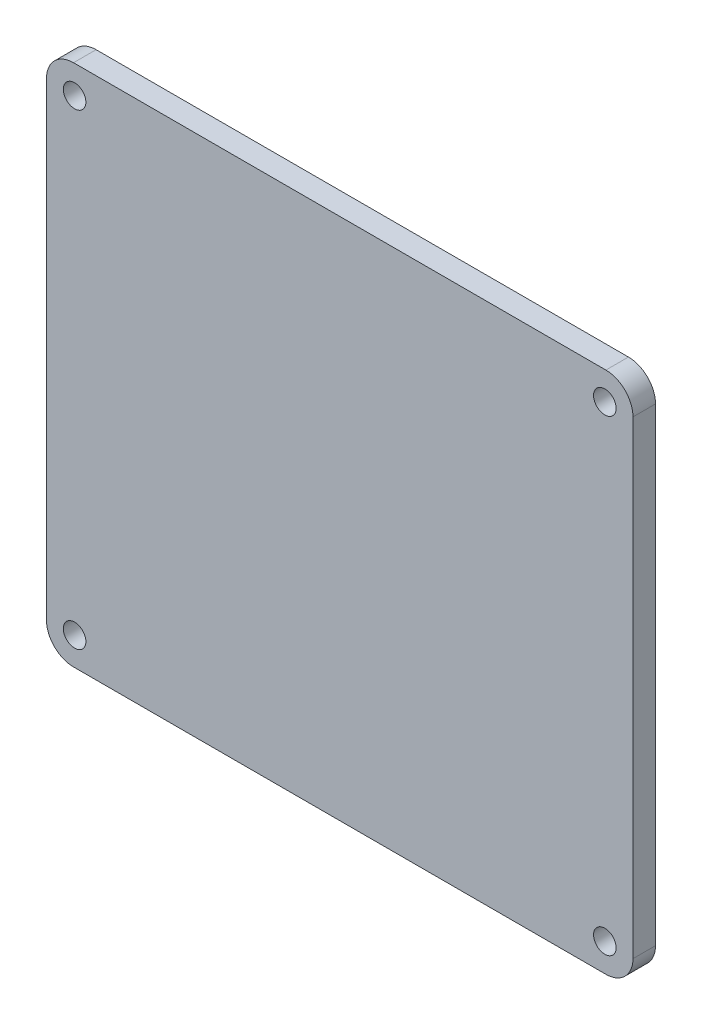
ISO-10303-21;
HEADER;
FILE_DESCRIPTION(('STEP AP214'),'2;1');
FILE_NAME('part.step','',(''),(''),'','','');
FILE_SCHEMA(('AUTOMOTIVE_DESIGN { 1 0 10303 214 1 1 1 1 }'));
ENDSEC;
DATA;
#1=APPLICATION_CONTEXT('core data for automotive mechanical design processes');
#2=APPLICATION_PROTOCOL_DEFINITION('international standard','automotive_design',2000,#1);
#3=PRODUCT_CONTEXT('',#1,'mechanical');
#4=PRODUCT('Part','Part','',(#3));
#5=PRODUCT_RELATED_PRODUCT_CATEGORY('part','',(#4));
#6=PRODUCT_DEFINITION_FORMATION('','',#4);
#7=PRODUCT_DEFINITION_CONTEXT('part definition',#1,'design');
#8=PRODUCT_DEFINITION('design','',#6,#7);
#9=PRODUCT_DEFINITION_SHAPE('','',#8);
#10=(LENGTH_UNIT() NAMED_UNIT(*) SI_UNIT(.MILLI.,.METRE.));
#11=(NAMED_UNIT(*) PLANE_ANGLE_UNIT() SI_UNIT($,.RADIAN.));
#12=(NAMED_UNIT(*) SI_UNIT($,.STERADIAN.) SOLID_ANGLE_UNIT());
#13=UNCERTAINTY_MEASURE_WITH_UNIT(LENGTH_MEASURE(1.E-05),#10,'distance_accuracy_value','');
#14=(GEOMETRIC_REPRESENTATION_CONTEXT(3) GLOBAL_UNCERTAINTY_ASSIGNED_CONTEXT((#13)) GLOBAL_UNIT_ASSIGNED_CONTEXT((#10,
#11,#12)) REPRESENTATION_CONTEXT('',''));
#15=CARTESIAN_POINT('',(0.,0.,0.));
#16=DIRECTION('',(0.,0.,1.));
#17=DIRECTION('',(1.,0.,0.));
#18=AXIS2_PLACEMENT_3D('',#15,#16,#17);
#19=CARTESIAN_POINT('',(0.,0.,2.5));
#20=DIRECTION('',(0.,1.,0.));
#21=DIRECTION('',(-1.,0.,0.));
#22=AXIS2_PLACEMENT_3D('',#19,#20,#21);
#23=PLANE('',#22);
#24=DIRECTION('',(1.,0.,0.));
#25=VECTOR('',#24,1.);
#26=CARTESIAN_POINT('',(0.,0.,0.));
#27=LINE('',#26,#25);
#28=CARTESIAN_POINT('',(3.,0.,0.));
#29=VERTEX_POINT('',#28);
#30=CARTESIAN_POINT('',(62.,0.,0.));
#31=VERTEX_POINT('',#30);
#32=EDGE_CURVE('E158',#29,#31,#27,.T.);
#33=ORIENTED_EDGE('',*,*,#32,.T.);
#34=DIRECTION('',(0.,0.,-1.));
#35=VECTOR('',#34,1.);
#36=CARTESIAN_POINT('',(62.,0.,2.5));
#37=LINE('',#36,#35);
#38=CARTESIAN_POINT('',(62.,0.,2.5));
#39=VERTEX_POINT('',#38);
#40=EDGE_CURVE('E145',#31,#39,#37,.F.);
#41=ORIENTED_EDGE('',*,*,#40,.T.);
#42=DIRECTION('',(1.,0.,0.));
#43=VECTOR('',#42,1.);
#44=CARTESIAN_POINT('',(0.,0.,2.5));
#45=LINE('',#44,#43);
#46=CARTESIAN_POINT('',(3.,0.,2.5));
#47=VERTEX_POINT('',#46);
#48=EDGE_CURVE('E160',#47,#39,#45,.T.);
#49=ORIENTED_EDGE('',*,*,#48,.F.);
#50=DIRECTION('',(0.,0.,-1.));
#51=VECTOR('',#50,1.);
#52=CARTESIAN_POINT('',(3.,0.,0.));
#53=LINE('',#52,#51);
#54=EDGE_CURVE('E142',#47,#29,#53,.T.);
#55=ORIENTED_EDGE('',*,*,#54,.T.);
#56=EDGE_LOOP('',(#33,#41,#49,#55));
#57=FACE_BOUND('',#56,.T.);
#58=ADVANCED_FACE('F33',(#57),#23,.F.);
#59=CARTESIAN_POINT('',(65.,0.,2.5));
#60=DIRECTION('',(-1.,0.,0.));
#61=DIRECTION('',(0.,0.,1.));
#62=AXIS2_PLACEMENT_3D('',#59,#60,#61);
#63=PLANE('',#62);
#64=DIRECTION('',(0.,1.,0.));
#65=VECTOR('',#64,1.);
#66=CARTESIAN_POINT('',(65.,0.,0.));
#67=LINE('',#66,#65);
#68=CARTESIAN_POINT('',(65.,3.,0.));
#69=VERTEX_POINT('',#68);
#70=CARTESIAN_POINT('',(65.,55.,0.));
#71=VERTEX_POINT('',#70);
#72=EDGE_CURVE('E116',#69,#71,#67,.T.);
#73=ORIENTED_EDGE('',*,*,#72,.T.);
#74=DIRECTION('',(0.,0.,-1.));
#75=VECTOR('',#74,1.);
#76=CARTESIAN_POINT('',(65.,55.,2.5));
#77=LINE('',#76,#75);
#78=CARTESIAN_POINT('',(65.,55.,2.5));
#79=VERTEX_POINT('',#78);
#80=EDGE_CURVE('E133',#71,#79,#77,.F.);
#81=ORIENTED_EDGE('',*,*,#80,.T.);
#82=DIRECTION('',(0.,1.,0.));
#83=VECTOR('',#82,1.);
#84=CARTESIAN_POINT('',(65.,0.,2.5));
#85=LINE('',#84,#83);
#86=CARTESIAN_POINT('',(65.,3.,2.5));
#87=VERTEX_POINT('',#86);
#88=EDGE_CURVE('E171',#87,#79,#85,.T.);
#89=ORIENTED_EDGE('',*,*,#88,.F.);
#90=DIRECTION('',(0.,0.,-1.));
#91=VECTOR('',#90,1.);
#92=CARTESIAN_POINT('',(65.,3.,2.5));
#93=LINE('',#92,#91);
#94=EDGE_CURVE('E130',#87,#69,#93,.T.);
#95=ORIENTED_EDGE('',*,*,#94,.T.);
#96=EDGE_LOOP('',(#73,#81,#89,#95));
#97=FACE_BOUND('',#96,.T.);
#98=ADVANCED_FACE('F218',(#97),#63,.F.);
#99=CARTESIAN_POINT('',(0.,58.,2.5));
#100=DIRECTION('',(0.,1.,0.));
#101=DIRECTION('',(-1.,0.,0.));
#102=AXIS2_PLACEMENT_3D('',#99,#100,#101);
#103=PLANE('',#102);
#104=DIRECTION('',(1.,0.,0.));
#105=VECTOR('',#104,1.);
#106=CARTESIAN_POINT('',(0.,58.,2.5));
#107=LINE('',#106,#105);
#108=CARTESIAN_POINT('',(3.,58.,2.5));
#109=VERTEX_POINT('',#108);
#110=CARTESIAN_POINT('',(62.,58.,2.5));
#111=VERTEX_POINT('',#110);
#112=EDGE_CURVE('E121',#109,#111,#107,.T.);
#113=ORIENTED_EDGE('',*,*,#112,.T.);
#114=DIRECTION('',(0.,0.,-1.));
#115=VECTOR('',#114,1.);
#116=CARTESIAN_POINT('',(62.,58.,0.));
#117=LINE('',#116,#115);
#118=CARTESIAN_POINT('',(62.,58.,0.));
#119=VERTEX_POINT('',#118);
#120=EDGE_CURVE('E108',#111,#119,#117,.T.);
#121=ORIENTED_EDGE('',*,*,#120,.T.);
#122=DIRECTION('',(1.,0.,0.));
#123=VECTOR('',#122,1.);
#124=CARTESIAN_POINT('',(0.,58.,0.));
#125=LINE('',#124,#123);
#126=CARTESIAN_POINT('',(3.,58.,0.));
#127=VERTEX_POINT('',#126);
#128=EDGE_CURVE('E101',#127,#119,#125,.T.);
#129=ORIENTED_EDGE('',*,*,#128,.F.);
#130=DIRECTION('',(0.,0.,-1.));
#131=VECTOR('',#130,1.);
#132=CARTESIAN_POINT('',(3.,58.,2.5));
#133=LINE('',#132,#131);
#134=EDGE_CURVE('E114',#127,#109,#133,.F.);
#135=ORIENTED_EDGE('',*,*,#134,.T.);
#136=EDGE_LOOP('',(#113,#121,#129,#135));
#137=FACE_BOUND('',#136,.T.);
#138=ADVANCED_FACE('F113',(#137),#103,.T.);
#139=CARTESIAN_POINT('',(0.,0.,2.5));
#140=DIRECTION('',(-1.,0.,0.));
#141=DIRECTION('',(0.,-1.,0.));
#142=AXIS2_PLACEMENT_3D('',#139,#140,#141);
#143=PLANE('',#142);
#144=DIRECTION('',(0.,1.,0.));
#145=VECTOR('',#144,1.);
#146=CARTESIAN_POINT('',(0.,0.,0.));
#147=LINE('',#146,#145);
#148=CARTESIAN_POINT('',(0.,3.,0.));
#149=VERTEX_POINT('',#148);
#150=CARTESIAN_POINT('',(0.,55.,0.));
#151=VERTEX_POINT('',#150);
#152=EDGE_CURVE('E102',#149,#151,#147,.T.);
#153=ORIENTED_EDGE('',*,*,#152,.F.);
#154=DIRECTION('',(0.,0.,-1.));
#155=VECTOR('',#154,1.);
#156=CARTESIAN_POINT('',(0.,3.,2.5));
#157=LINE('',#156,#155);
#158=CARTESIAN_POINT('',(0.,3.,2.5));
#159=VERTEX_POINT('',#158);
#160=EDGE_CURVE('E11',#149,#159,#157,.F.);
#161=ORIENTED_EDGE('',*,*,#160,.T.);
#162=DIRECTION('',(0.,1.,0.));
#163=VECTOR('',#162,1.);
#164=CARTESIAN_POINT('',(0.,0.,2.5));
#165=LINE('',#164,#163);
#166=CARTESIAN_POINT('',(0.,55.,2.5));
#167=VERTEX_POINT('',#166);
#168=EDGE_CURVE('E118',#159,#167,#165,.T.);
#169=ORIENTED_EDGE('',*,*,#168,.T.);
#170=DIRECTION('',(0.,0.,-1.));
#171=VECTOR('',#170,1.);
#172=CARTESIAN_POINT('',(0.,55.,2.5));
#173=LINE('',#172,#171);
#174=EDGE_CURVE('E41',#167,#151,#173,.T.);
#175=ORIENTED_EDGE('',*,*,#174,.T.);
#176=EDGE_LOOP('',(#153,#161,#169,#175));
#177=FACE_BOUND('',#176,.T.);
#178=ADVANCED_FACE('F146',(#177),#143,.T.);
#179=CARTESIAN_POINT('',(0.,0.,2.5));
#180=DIRECTION('',(0.,0.,1.));
#181=DIRECTION('',(1.,0.,0.));
#182=AXIS2_PLACEMENT_3D('',#179,#180,#181);
#183=PLANE('',#182);
#184=CARTESIAN_POINT('',(3.1155036511468,3.1155036511468,2.5));
#185=DIRECTION('',(0.,0.,1.));
#186=DIRECTION('',(1.,0.,0.));
#187=AXIS2_PLACEMENT_3D('',#184,#185,#186);
#188=CIRCLE('',#187,1.25);
#189=CARTESIAN_POINT('',(4.3655036511468,3.1155036511468,2.5));
#190=VERTEX_POINT('',#189);
#191=EDGE_CURVE('E180',#190,#190,#188,.T.);
#192=ORIENTED_EDGE('',*,*,#191,.F.);
#193=EDGE_LOOP('',(#192));
#194=FACE_BOUND('',#193,.T.);
#195=CARTESIAN_POINT('',(61.8844963488532,3.11550365114681,2.5));
#196=DIRECTION('',(0.,0.,1.));
#197=DIRECTION('',(1.,0.,0.));
#198=AXIS2_PLACEMENT_3D('',#195,#196,#197);
#199=CIRCLE('',#198,1.25);
#200=CARTESIAN_POINT('',(63.1344963488532,3.11550365114681,2.5));
#201=VERTEX_POINT('',#200);
#202=EDGE_CURVE('E186',#201,#201,#199,.T.);
#203=ORIENTED_EDGE('',*,*,#202,.F.);
#204=EDGE_LOOP('',(#203));
#205=FACE_BOUND('',#204,.T.);
#206=CARTESIAN_POINT('',(61.8844963488532,54.8844963488532,2.5));
#207=DIRECTION('',(0.,0.,1.));
#208=DIRECTION('',(1.,0.,0.));
#209=AXIS2_PLACEMENT_3D('',#206,#207,#208);
#210=CIRCLE('',#209,1.24999999999997);
#211=CARTESIAN_POINT('',(63.1344963488532,54.8844963488532,2.5));
#212=VERTEX_POINT('',#211);
#213=EDGE_CURVE('E175',#212,#212,#210,.T.);
#214=ORIENTED_EDGE('',*,*,#213,.F.);
#215=EDGE_LOOP('',(#214));
#216=FACE_BOUND('',#215,.T.);
#217=CARTESIAN_POINT('',(3.1155036511468,54.8844963488532,2.5));
#218=DIRECTION('',(0.,0.,1.));
#219=DIRECTION('',(1.,0.,0.));
#220=AXIS2_PLACEMENT_3D('',#217,#218,#219);
#221=CIRCLE('',#220,1.25);
#222=CARTESIAN_POINT('',(4.3655036511468,54.8844963488532,2.5));
#223=VERTEX_POINT('',#222);
#224=EDGE_CURVE('E162',#223,#223,#221,.T.);
#225=ORIENTED_EDGE('',*,*,#224,.F.);
#226=EDGE_LOOP('',(#225));
#227=FACE_BOUND('',#226,.T.);
#228=ORIENTED_EDGE('',*,*,#88,.T.);
#229=CARTESIAN_POINT('',(62.,55.,2.5));
#230=DIRECTION('',(0.,0.,1.));
#231=DIRECTION('',(1.,0.,0.));
#232=AXIS2_PLACEMENT_3D('',#229,#230,#231);
#233=CIRCLE('',#232,3.);
#234=EDGE_CURVE('E140',#79,#111,#233,.T.);
#235=ORIENTED_EDGE('',*,*,#234,.T.);
#236=ORIENTED_EDGE('',*,*,#112,.F.);
#237=CARTESIAN_POINT('',(3.,55.,2.5));
#238=DIRECTION('',(0.,0.,1.));
#239=DIRECTION('',(1.,0.,0.));
#240=AXIS2_PLACEMENT_3D('',#237,#238,#239);
#241=CIRCLE('',#240,3.);
#242=EDGE_CURVE('E48',#109,#167,#241,.T.);
#243=ORIENTED_EDGE('',*,*,#242,.T.);
#244=ORIENTED_EDGE('',*,*,#168,.F.);
#245=CARTESIAN_POINT('',(3.,3.,2.5));
#246=DIRECTION('',(0.,0.,1.));
#247=DIRECTION('',(1.,0.,0.));
#248=AXIS2_PLACEMENT_3D('',#245,#246,#247);
#249=CIRCLE('',#248,3.);
#250=EDGE_CURVE('E136',#159,#47,#249,.T.);
#251=ORIENTED_EDGE('',*,*,#250,.T.);
#252=ORIENTED_EDGE('',*,*,#48,.T.);
#253=CARTESIAN_POINT('',(62.,3.,2.5));
#254=DIRECTION('',(0.,0.,1.));
#255=DIRECTION('',(1.,0.,0.));
#256=AXIS2_PLACEMENT_3D('',#253,#254,#255);
#257=CIRCLE('',#256,3.);
#258=EDGE_CURVE('E138',#39,#87,#257,.T.);
#259=ORIENTED_EDGE('',*,*,#258,.T.);
#260=EDGE_LOOP('',(#228,#235,#236,#243,#244,#251,#252,#259));
#261=FACE_BOUND('',#260,.T.);
#262=ADVANCED_FACE('F149',(#194,#205,#216,#227,#261),#183,.T.);
#263=CARTESIAN_POINT('',(0.,0.,0.));
#264=DIRECTION('',(0.,0.,1.));
#265=DIRECTION('',(1.,0.,0.));
#266=AXIS2_PLACEMENT_3D('',#263,#264,#265);
#267=PLANE('',#266);
#268=CARTESIAN_POINT('',(3.1155036511468,3.1155036511468,0.));
#269=DIRECTION('',(0.,0.,1.));
#270=DIRECTION('',(1.,0.,0.));
#271=AXIS2_PLACEMENT_3D('',#268,#269,#270);
#272=CIRCLE('',#271,1.25);
#273=CARTESIAN_POINT('',(4.3655036511468,3.1155036511468,0.));
#274=VERTEX_POINT('',#273);
#275=EDGE_CURVE('E177',#274,#274,#272,.T.);
#276=ORIENTED_EDGE('',*,*,#275,.T.);
#277=EDGE_LOOP('',(#276));
#278=FACE_BOUND('',#277,.T.);
#279=CARTESIAN_POINT('',(61.8844963488532,3.11550365114681,0.));
#280=DIRECTION('',(0.,0.,1.));
#281=DIRECTION('',(1.,0.,0.));
#282=AXIS2_PLACEMENT_3D('',#279,#280,#281);
#283=CIRCLE('',#282,1.25);
#284=CARTESIAN_POINT('',(63.1344963488532,3.11550365114681,0.));
#285=VERTEX_POINT('',#284);
#286=EDGE_CURVE('E183',#285,#285,#283,.T.);
#287=ORIENTED_EDGE('',*,*,#286,.T.);
#288=EDGE_LOOP('',(#287));
#289=FACE_BOUND('',#288,.T.);
#290=CARTESIAN_POINT('',(61.8844963488532,54.8844963488532,0.));
#291=DIRECTION('',(0.,0.,1.));
#292=DIRECTION('',(1.,0.,0.));
#293=AXIS2_PLACEMENT_3D('',#290,#291,#292);
#294=CIRCLE('',#293,1.24999999999997);
#295=CARTESIAN_POINT('',(63.1344963488532,54.8844963488532,0.));
#296=VERTEX_POINT('',#295);
#297=EDGE_CURVE('E189',#296,#296,#294,.T.);
#298=ORIENTED_EDGE('',*,*,#297,.T.);
#299=EDGE_LOOP('',(#298));
#300=FACE_BOUND('',#299,.T.);
#301=CARTESIAN_POINT('',(3.1155036511468,54.8844963488532,0.));
#302=DIRECTION('',(0.,0.,1.));
#303=DIRECTION('',(1.,0.,0.));
#304=AXIS2_PLACEMENT_3D('',#301,#302,#303);
#305=CIRCLE('',#304,1.25);
#306=CARTESIAN_POINT('',(4.3655036511468,54.8844963488532,0.));
#307=VERTEX_POINT('',#306);
#308=EDGE_CURVE('E167',#307,#307,#305,.T.);
#309=ORIENTED_EDGE('',*,*,#308,.T.);
#310=EDGE_LOOP('',(#309));
#311=FACE_BOUND('',#310,.T.);
#312=ORIENTED_EDGE('',*,*,#128,.T.);
#313=CARTESIAN_POINT('',(62.,55.,0.));
#314=DIRECTION('',(0.,0.,1.));
#315=DIRECTION('',(1.,0.,0.));
#316=AXIS2_PLACEMENT_3D('',#313,#314,#315);
#317=CIRCLE('',#316,3.);
#318=EDGE_CURVE('E128',#119,#71,#317,.F.);
#319=ORIENTED_EDGE('',*,*,#318,.T.);
#320=ORIENTED_EDGE('',*,*,#72,.F.);
#321=CARTESIAN_POINT('',(62.,3.,0.));
#322=DIRECTION('',(0.,0.,1.));
#323=DIRECTION('',(1.,0.,0.));
#324=AXIS2_PLACEMENT_3D('',#321,#322,#323);
#325=CIRCLE('',#324,3.);
#326=EDGE_CURVE('E126',#69,#31,#325,.F.);
#327=ORIENTED_EDGE('',*,*,#326,.T.);
#328=ORIENTED_EDGE('',*,*,#32,.F.);
#329=CARTESIAN_POINT('',(3.,3.,0.));
#330=DIRECTION('',(0.,0.,1.));
#331=DIRECTION('',(1.,0.,0.));
#332=AXIS2_PLACEMENT_3D('',#329,#330,#331);
#333=CIRCLE('',#332,3.);
#334=EDGE_CURVE('E107',#29,#149,#333,.F.);
#335=ORIENTED_EDGE('',*,*,#334,.T.);
#336=ORIENTED_EDGE('',*,*,#152,.T.);
#337=CARTESIAN_POINT('',(3.,55.,0.));
#338=DIRECTION('',(0.,0.,1.));
#339=DIRECTION('',(1.,0.,0.));
#340=AXIS2_PLACEMENT_3D('',#337,#338,#339);
#341=CIRCLE('',#340,3.);
#342=EDGE_CURVE('E98',#151,#127,#341,.F.);
#343=ORIENTED_EDGE('',*,*,#342,.T.);
#344=EDGE_LOOP('',(#312,#319,#320,#327,#328,#335,#336,#343));
#345=FACE_BOUND('',#344,.T.);
#346=ADVANCED_FACE('F100',(#278,#289,#300,#311,#345),#267,.F.);
#347=CARTESIAN_POINT('',(3.1155036511468,54.8844963488532,2.5));
#348=DIRECTION('',(0.,0.,-1.));
#349=DIRECTION('',(-1.,0.,0.));
#350=AXIS2_PLACEMENT_3D('',#347,#348,#349);
#351=CYLINDRICAL_SURFACE('',#350,1.25);
#352=ORIENTED_EDGE('',*,*,#224,.T.);
#353=EDGE_LOOP('',(#352));
#354=FACE_BOUND('',#353,.T.);
#355=ORIENTED_EDGE('',*,*,#308,.F.);
#356=EDGE_LOOP('',(#355));
#357=FACE_BOUND('',#356,.T.);
#358=ADVANCED_FACE('F204',(#354,#357),#351,.F.);
#359=CARTESIAN_POINT('',(61.8844963488532,54.8844963488532,2.5));
#360=DIRECTION('',(0.,0.,-1.));
#361=DIRECTION('',(-1.,0.,0.));
#362=AXIS2_PLACEMENT_3D('',#359,#360,#361);
#363=CYLINDRICAL_SURFACE('',#362,1.24999999999997);
#364=ORIENTED_EDGE('',*,*,#213,.T.);
#365=EDGE_LOOP('',(#364));
#366=FACE_BOUND('',#365,.T.);
#367=ORIENTED_EDGE('',*,*,#297,.F.);
#368=EDGE_LOOP('',(#367));
#369=FACE_BOUND('',#368,.T.);
#370=ADVANCED_FACE('F195',(#366,#369),#363,.F.);
#371=CARTESIAN_POINT('',(61.8844963488532,3.11550365114681,2.5));
#372=DIRECTION('',(0.,0.,-1.));
#373=DIRECTION('',(-1.,0.,0.));
#374=AXIS2_PLACEMENT_3D('',#371,#372,#373);
#375=CYLINDRICAL_SURFACE('',#374,1.25);
#376=ORIENTED_EDGE('',*,*,#202,.T.);
#377=EDGE_LOOP('',(#376));
#378=FACE_BOUND('',#377,.T.);
#379=ORIENTED_EDGE('',*,*,#286,.F.);
#380=EDGE_LOOP('',(#379));
#381=FACE_BOUND('',#380,.T.);
#382=ADVANCED_FACE('F301',(#378,#381),#375,.F.);
#383=CARTESIAN_POINT('',(3.1155036511468,3.1155036511468,2.5));
#384=DIRECTION('',(0.,0.,-1.));
#385=DIRECTION('',(-1.,0.,0.));
#386=AXIS2_PLACEMENT_3D('',#383,#384,#385);
#387=CYLINDRICAL_SURFACE('',#386,1.25);
#388=ORIENTED_EDGE('',*,*,#191,.T.);
#389=EDGE_LOOP('',(#388));
#390=FACE_BOUND('',#389,.T.);
#391=ORIENTED_EDGE('',*,*,#275,.F.);
#392=EDGE_LOOP('',(#391));
#393=FACE_BOUND('',#392,.T.);
#394=ADVANCED_FACE('F231',(#390,#393),#387,.F.);
#395=CARTESIAN_POINT('',(62.,55.,2.5));
#396=DIRECTION('',(0.,0.,1.));
#397=DIRECTION('',(1.,0.,0.));
#398=AXIS2_PLACEMENT_3D('',#395,#396,#397);
#399=CYLINDRICAL_SURFACE('',#398,3.);
#400=ORIENTED_EDGE('',*,*,#234,.F.);
#401=ORIENTED_EDGE('',*,*,#80,.F.);
#402=ORIENTED_EDGE('',*,*,#318,.F.);
#403=ORIENTED_EDGE('',*,*,#120,.F.);
#404=EDGE_LOOP('',(#400,#401,#402,#403));
#405=FACE_BOUND('',#404,.T.);
#406=ADVANCED_FACE('F227',(#405),#399,.T.);
#407=CARTESIAN_POINT('',(62.,3.,2.5));
#408=DIRECTION('',(0.,0.,-1.));
#409=DIRECTION('',(-1.,0.,0.));
#410=AXIS2_PLACEMENT_3D('',#407,#408,#409);
#411=CYLINDRICAL_SURFACE('',#410,3.);
#412=ORIENTED_EDGE('',*,*,#258,.F.);
#413=ORIENTED_EDGE('',*,*,#40,.F.);
#414=ORIENTED_EDGE('',*,*,#326,.F.);
#415=ORIENTED_EDGE('',*,*,#94,.F.);
#416=EDGE_LOOP('',(#412,#413,#414,#415));
#417=FACE_BOUND('',#416,.T.);
#418=ADVANCED_FACE('F230',(#417),#411,.T.);
#419=CARTESIAN_POINT('',(3.,3.,2.5));
#420=DIRECTION('',(0.,0.,1.));
#421=DIRECTION('',(1.,0.,0.));
#422=AXIS2_PLACEMENT_3D('',#419,#420,#421);
#423=CYLINDRICAL_SURFACE('',#422,3.);
#424=ORIENTED_EDGE('',*,*,#250,.F.);
#425=ORIENTED_EDGE('',*,*,#160,.F.);
#426=ORIENTED_EDGE('',*,*,#334,.F.);
#427=ORIENTED_EDGE('',*,*,#54,.F.);
#428=EDGE_LOOP('',(#424,#425,#426,#427));
#429=FACE_BOUND('',#428,.T.);
#430=ADVANCED_FACE('F154',(#429),#423,.T.);
#431=CARTESIAN_POINT('',(3.,55.,2.5));
#432=DIRECTION('',(0.,0.,-1.));
#433=DIRECTION('',(-1.,0.,0.));
#434=AXIS2_PLACEMENT_3D('',#431,#432,#433);
#435=CYLINDRICAL_SURFACE('',#434,3.);
#436=ORIENTED_EDGE('',*,*,#242,.F.);
#437=ORIENTED_EDGE('',*,*,#134,.F.);
#438=ORIENTED_EDGE('',*,*,#342,.F.);
#439=ORIENTED_EDGE('',*,*,#174,.F.);
#440=EDGE_LOOP('',(#436,#437,#438,#439));
#441=FACE_BOUND('',#440,.T.);
#442=ADVANCED_FACE('F35',(#441),#435,.T.);
#443=CLOSED_SHELL('',(#58,#98,#138,#178,#262,#346,#358,#370,#382,#394,#406,#418,#430,#442));
#444=MANIFOLD_SOLID_BREP('B2',#443);
#445=ADVANCED_BREP_SHAPE_REPRESENTATION('',(#18,#444),#14);
#446=SHAPE_DEFINITION_REPRESENTATION(#9,#445);
ENDSEC;
END-ISO-10303-21;
